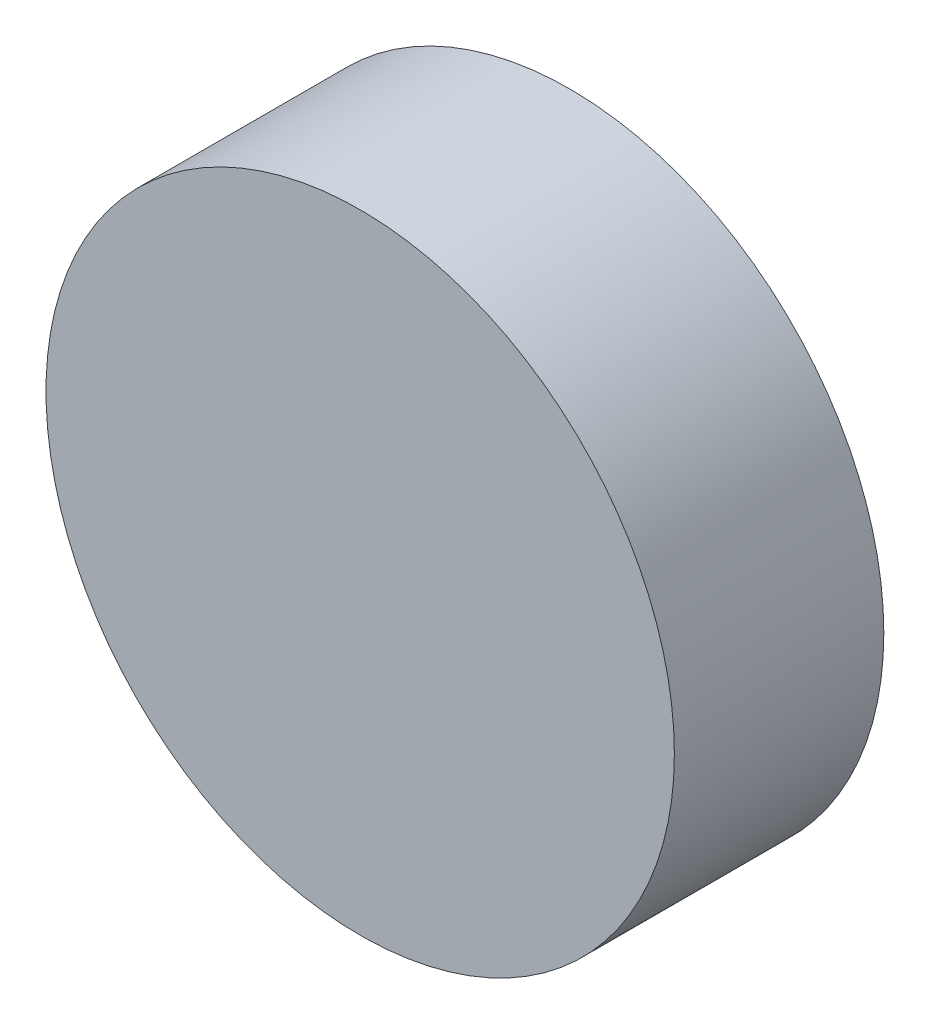
ISO-10303-21;
HEADER;
FILE_DESCRIPTION(('STEP AP214'),'2;1');
FILE_NAME('part.step','',(''),(''),'','','');
FILE_SCHEMA(('AUTOMOTIVE_DESIGN { 1 0 10303 214 1 1 1 1 }'));
ENDSEC;
DATA;
#1=APPLICATION_CONTEXT('core data for automotive mechanical design processes');
#2=APPLICATION_PROTOCOL_DEFINITION('international standard','automotive_design',2000,#1);
#3=PRODUCT_CONTEXT('',#1,'mechanical');
#4=PRODUCT('Part','Part','',(#3));
#5=PRODUCT_RELATED_PRODUCT_CATEGORY('part','',(#4));
#6=PRODUCT_DEFINITION_FORMATION('','',#4);
#7=PRODUCT_DEFINITION_CONTEXT('part definition',#1,'design');
#8=PRODUCT_DEFINITION('design','',#6,#7);
#9=PRODUCT_DEFINITION_SHAPE('','',#8);
#10=(LENGTH_UNIT() NAMED_UNIT(*) SI_UNIT(.MILLI.,.METRE.));
#11=(NAMED_UNIT(*) PLANE_ANGLE_UNIT() SI_UNIT($,.RADIAN.));
#12=(NAMED_UNIT(*) SI_UNIT($,.STERADIAN.) SOLID_ANGLE_UNIT());
#13=UNCERTAINTY_MEASURE_WITH_UNIT(LENGTH_MEASURE(1.E-05),#10,'distance_accuracy_value','');
#14=(GEOMETRIC_REPRESENTATION_CONTEXT(3) GLOBAL_UNCERTAINTY_ASSIGNED_CONTEXT((#13)) GLOBAL_UNIT_ASSIGNED_CONTEXT((#10,
#11,#12)) REPRESENTATION_CONTEXT('',''));
#15=CARTESIAN_POINT('',(0.,0.,0.));
#16=DIRECTION('',(0.,0.,1.));
#17=DIRECTION('',(1.,0.,0.));
#18=AXIS2_PLACEMENT_3D('',#15,#16,#17);
#19=CARTESIAN_POINT('',(0.,0.,1.));
#20=DIRECTION('',(0.,0.,-1.));
#21=DIRECTION('',(-1.,0.,0.));
#22=AXIS2_PLACEMENT_3D('',#19,#20,#21);
#23=CYLINDRICAL_SURFACE('',#22,1.5);
#24=CARTESIAN_POINT('',(0.,0.,1.));
#25=DIRECTION('',(0.,0.,1.));
#26=DIRECTION('',(1.,0.,0.));
#27=AXIS2_PLACEMENT_3D('',#24,#25,#26);
#28=CIRCLE('',#27,1.5);
#29=CARTESIAN_POINT('',(1.5,0.,1.));
#30=VERTEX_POINT('',#29);
#31=EDGE_CURVE('E10',#30,#30,#28,.T.);
#32=ORIENTED_EDGE('',*,*,#31,.F.);
#33=EDGE_LOOP('',(#32));
#34=FACE_BOUND('',#33,.T.);
#35=CARTESIAN_POINT('',(0.,0.,0.));
#36=DIRECTION('',(0.,0.,1.));
#37=DIRECTION('',(1.,0.,0.));
#38=AXIS2_PLACEMENT_3D('',#35,#36,#37);
#39=CIRCLE('',#38,1.5);
#40=CARTESIAN_POINT('',(1.5,0.,0.));
#41=VERTEX_POINT('',#40);
#42=EDGE_CURVE('E34',#41,#41,#39,.T.);
#43=ORIENTED_EDGE('',*,*,#42,.T.);
#44=EDGE_LOOP('',(#43));
#45=FACE_BOUND('',#44,.T.);
#46=ADVANCED_FACE('F31',(#34,#45),#23,.T.);
#47=CARTESIAN_POINT('',(0.,0.,1.));
#48=DIRECTION('',(0.,0.,1.));
#49=DIRECTION('',(1.,0.,0.));
#50=AXIS2_PLACEMENT_3D('',#47,#48,#49);
#51=PLANE('',#50);
#52=ORIENTED_EDGE('',*,*,#31,.T.);
#53=EDGE_LOOP('',(#52));
#54=FACE_BOUND('',#53,.T.);
#55=ADVANCED_FACE('F46',(#54),#51,.T.);
#56=CARTESIAN_POINT('',(0.,0.,0.));
#57=DIRECTION('',(0.,0.,1.));
#58=DIRECTION('',(1.,0.,0.));
#59=AXIS2_PLACEMENT_3D('',#56,#57,#58);
#60=PLANE('',#59);
#61=ORIENTED_EDGE('',*,*,#42,.F.);
#62=EDGE_LOOP('',(#61));
#63=FACE_BOUND('',#62,.T.);
#64=ADVANCED_FACE('F44',(#63),#60,.F.);
#65=CLOSED_SHELL('',(#46,#55,#64));
#66=MANIFOLD_SOLID_BREP('B2',#65);
#67=ADVANCED_BREP_SHAPE_REPRESENTATION('',(#18,#66),#14);
#68=SHAPE_DEFINITION_REPRESENTATION(#9,#67);
ENDSEC;
END-ISO-10303-21;
